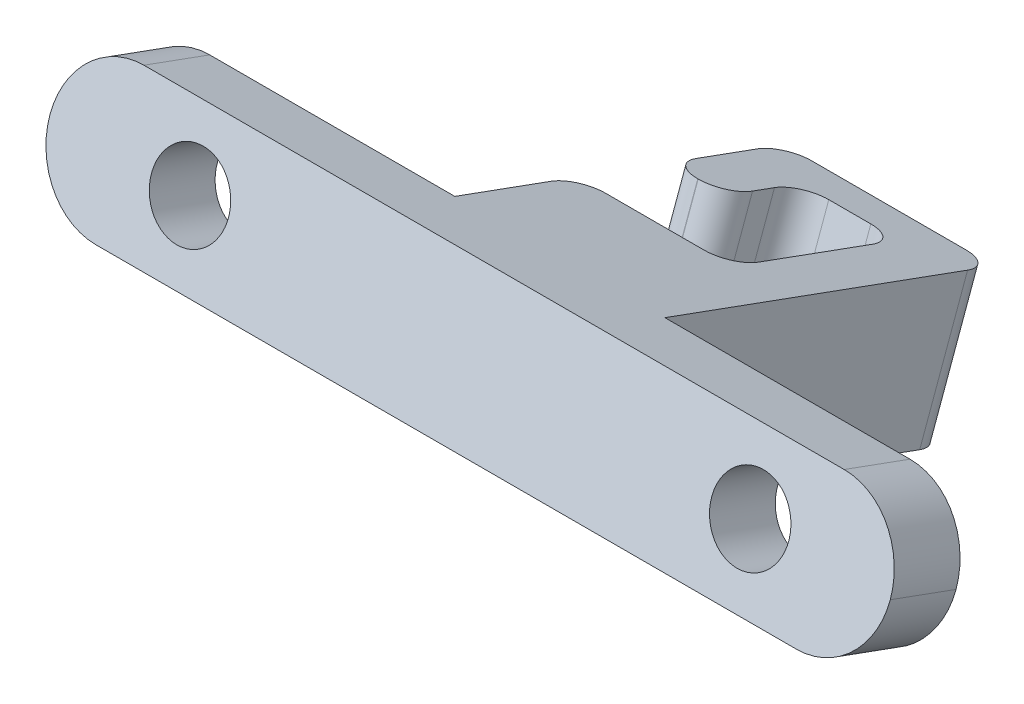
ISO-10303-21;
HEADER;
FILE_DESCRIPTION(('STEP AP214'),'2;1');
FILE_NAME('part.step','',(''),(''),'','','');
FILE_SCHEMA(('AUTOMOTIVE_DESIGN { 1 0 10303 214 1 1 1 1 }'));
ENDSEC;
DATA;
#1=APPLICATION_CONTEXT('core data for automotive mechanical design processes');
#2=APPLICATION_PROTOCOL_DEFINITION('international standard','automotive_design',2000,#1);
#3=PRODUCT_CONTEXT('',#1,'mechanical');
#4=PRODUCT('Part','Part','',(#3));
#5=PRODUCT_RELATED_PRODUCT_CATEGORY('part','',(#4));
#6=PRODUCT_DEFINITION_FORMATION('','',#4);
#7=PRODUCT_DEFINITION_CONTEXT('part definition',#1,'design');
#8=PRODUCT_DEFINITION('design','',#6,#7);
#9=PRODUCT_DEFINITION_SHAPE('','',#8);
#10=(LENGTH_UNIT() NAMED_UNIT(*) SI_UNIT(.MILLI.,.METRE.));
#11=(NAMED_UNIT(*) PLANE_ANGLE_UNIT() SI_UNIT($,.RADIAN.));
#12=(NAMED_UNIT(*) SI_UNIT($,.STERADIAN.) SOLID_ANGLE_UNIT());
#13=UNCERTAINTY_MEASURE_WITH_UNIT(LENGTH_MEASURE(1.E-05),#10,'distance_accuracy_value','');
#14=(GEOMETRIC_REPRESENTATION_CONTEXT(3) GLOBAL_UNCERTAINTY_ASSIGNED_CONTEXT((#13)) GLOBAL_UNIT_ASSIGNED_CONTEXT((#10,
#11,#12)) REPRESENTATION_CONTEXT('',''));
#15=CARTESIAN_POINT('',(0.,0.,0.));
#16=DIRECTION('',(0.,0.,1.));
#17=DIRECTION('',(1.,0.,0.));
#18=AXIS2_PLACEMENT_3D('',#15,#16,#17);
#19=CARTESIAN_POINT('',(2.5,85.1744674403331,-31.0009708677575));
#20=DIRECTION('',(0.,0.939692620785907,-0.342020143325673));
#21=DIRECTION('',(0.,0.342020143325673,0.939692620785907));
#22=AXIS2_PLACEMENT_3D('',#19,#20,#21);
#23=PLANE('',#22);
#24=DIRECTION('',(-1.,0.,0.));
#25=VECTOR('',#24,1.);
#26=CARTESIAN_POINT('',(2.5,95.8646289623417,-1.62999347571675));
#27=LINE('',#26,#25);
#28=CARTESIAN_POINT('',(1.5299929499164,95.8646289623417,-1.62999347571675));
#29=VERTEX_POINT('',#28);
#30=CARTESIAN_POINT('',(-5.5,95.8646289623417,-1.62999347571675));
#31=VERTEX_POINT('',#30);
#32=EDGE_CURVE('E372',#29,#31,#27,.T.);
#33=ORIENTED_EDGE('',*,*,#32,.T.);
#34=CARTESIAN_POINT('',(-5.5,96.5486692489931,0.249391765855053));
#35=DIRECTION('',(0.,0.939692620785907,-0.342020143325673));
#36=DIRECTION('',(0.,0.342020143325673,0.939692620785907));
#37=AXIS2_PLACEMENT_3D('',#34,#35,#36);
#38=CIRCLE('',#37,2.);
#39=CARTESIAN_POINT('',(-7.5,96.5486692489931,0.249391765855034));
#40=VERTEX_POINT('',#39);
#41=EDGE_CURVE('E203',#31,#40,#38,.T.);
#42=ORIENTED_EDGE('',*,*,#41,.T.);
#43=DIRECTION('',(0.,0.342020143325672,0.939692620785907));
#44=VECTOR('',#43,1.);
#45=CARTESIAN_POINT('',(-7.5,90.506376157383,-16.35167206507));
#46=LINE('',#45,#44);
#47=CARTESIAN_POINT('',(-7.5,99.0568797405248,7.14064345457764));
#48=VERTEX_POINT('',#47);
#49=EDGE_CURVE('E198',#40,#48,#46,.T.);
#50=ORIENTED_EDGE('',*,*,#49,.T.);
#51=DIRECTION('',(-1.,0.,0.));
#52=VECTOR('',#51,1.);
#53=CARTESIAN_POINT('',(30.,99.0568797405248,7.14064345457762));
#54=LINE('',#53,#52);
#55=CARTESIAN_POINT('',(-24.9999999999999,99.0568797405248,7.14064345457762));
#56=VERTEX_POINT('',#55);
#57=EDGE_CURVE('E201',#48,#56,#54,.T.);
#58=ORIENTED_EDGE('',*,*,#57,.T.);
#59=DIRECTION('',(0.,0.342020143325673,0.939692620785907));
#60=VECTOR('',#59,1.);
#61=CARTESIAN_POINT('',(-25.,85.1744674403331,-31.0009708677575));
#62=LINE('',#61,#60);
#63=CARTESIAN_POINT('',(-25.,100.766980457153,11.8391065585071));
#64=VERTEX_POINT('',#63);
#65=EDGE_CURVE('E284',#56,#64,#62,.T.);
#66=ORIENTED_EDGE('',*,*,#65,.T.);
#67=DIRECTION('',(-1.,0.,0.));
#68=VECTOR('',#67,1.);
#69=CARTESIAN_POINT('',(-2.5,100.766980457153,11.8391065585071));
#70=LINE('',#69,#68);
#71=CARTESIAN_POINT('',(25.,100.766980457153,11.8391065585071));
#72=VERTEX_POINT('',#71);
#73=EDGE_CURVE('E261',#72,#64,#70,.T.);
#74=ORIENTED_EDGE('',*,*,#73,.F.);
#75=DIRECTION('',(0.,0.342020143325673,0.939692620785907));
#76=VECTOR('',#75,1.);
#77=CARTESIAN_POINT('',(25.,85.1744674403331,-31.0009708677575));
#78=LINE('',#77,#76);
#79=CARTESIAN_POINT('',(25.,99.0568797405248,7.14064345457762));
#80=VERTEX_POINT('',#79);
#81=EDGE_CURVE('E281',#72,#80,#78,.F.);
#82=ORIENTED_EDGE('',*,*,#81,.T.);
#83=CARTESIAN_POINT('',(7.5,99.0568797405248,7.14064345457762));
#84=VERTEX_POINT('',#83);
#85=EDGE_CURVE('E218',#80,#84,#54,.T.);
#86=ORIENTED_EDGE('',*,*,#85,.T.);
#87=DIRECTION('',(0.,0.342020143325672,0.939692620785907));
#88=VECTOR('',#87,1.);
#89=CARTESIAN_POINT('',(7.5,90.506376157383,-16.35167206507));
#90=LINE('',#89,#88);
#91=CARTESIAN_POINT('',(7.5,91.1904164440344,-14.4722868234982));
#92=VERTEX_POINT('',#91);
#93=EDGE_CURVE('E208',#92,#84,#90,.T.);
#94=ORIENTED_EDGE('',*,*,#93,.F.);
#95=CARTESIAN_POINT('',(5.5,91.1904164440343,-14.4722868234982));
#96=DIRECTION('',(0.,0.939692620785907,-0.342020143325673));
#97=DIRECTION('',(0.,0.342020143325673,0.939692620785907));
#98=AXIS2_PLACEMENT_3D('',#95,#96,#97);
#99=CIRCLE('',#98,2.);
#100=CARTESIAN_POINT('',(5.5,90.506376157383,-16.35167206507));
#101=VERTEX_POINT('',#100);
#102=EDGE_CURVE('E306',#92,#101,#99,.T.);
#103=ORIENTED_EDGE('',*,*,#102,.T.);
#104=DIRECTION('',(1.,0.,0.));
#105=VECTOR('',#104,1.);
#106=CARTESIAN_POINT('',(7.5,90.506376157383,-16.35167206507));
#107=LINE('',#106,#105);
#108=CARTESIAN_POINT('',(-5.5,90.506376157383,-16.35167206507));
#109=VERTEX_POINT('',#108);
#110=EDGE_CURVE('E228',#109,#101,#107,.T.);
#111=ORIENTED_EDGE('',*,*,#110,.F.);
#112=CARTESIAN_POINT('',(-5.5,91.1904164440343,-14.4722868234982));
#113=DIRECTION('',(0.,0.939692620785907,-0.342020143325673));
#114=DIRECTION('',(0.,0.342020143325673,0.939692620785907));
#115=AXIS2_PLACEMENT_3D('',#112,#113,#114);
#116=CIRCLE('',#115,2.);
#117=CARTESIAN_POINT('',(-7.5,91.1904164440344,-14.4722868234982));
#118=VERTEX_POINT('',#117);
#119=EDGE_CURVE('E308',#109,#118,#116,.T.);
#120=ORIENTED_EDGE('',*,*,#119,.T.);
#121=CARTESIAN_POINT('',(-7.5,92.7864476724107,-10.0872270627899));
#122=VERTEX_POINT('',#121);
#123=EDGE_CURVE('E207',#118,#122,#46,.T.);
#124=ORIENTED_EDGE('',*,*,#123,.T.);
#125=CARTESIAN_POINT('',(-5.5,92.7864476724106,-10.0872270627899));
#126=DIRECTION('',(0.,0.939692620785907,-0.342020143325673));
#127=DIRECTION('',(0.,0.342020143325673,0.939692620785907));
#128=AXIS2_PLACEMENT_3D('',#125,#126,#127);
#129=CIRCLE('',#128,2.);
#130=CARTESIAN_POINT('',(-5.5,93.470487959062,-8.20784182121811));
#131=VERTEX_POINT('',#130);
#132=EDGE_CURVE('E312',#122,#131,#129,.T.);
#133=ORIENTED_EDGE('',*,*,#132,.T.);
#134=DIRECTION('',(1.,0.,0.));
#135=VECTOR('',#134,1.);
#136=CARTESIAN_POINT('',(2.5,93.470487959062,-8.20784182121811));
#137=LINE('',#136,#135);
#138=CARTESIAN_POINT('',(-5.4700070500836,93.470487959062,-8.20784182121811));
#139=VERTEX_POINT('',#138);
#140=EDGE_CURVE('E719',#131,#139,#137,.T.);
#141=ORIENTED_EDGE('',*,*,#140,.T.);
#142=CARTESIAN_POINT('',(-5.4700070500836,92.7864476724106,-10.0872270627899));
#143=DIRECTION('',(0.,0.939692620785907,-0.342020143325673));
#144=DIRECTION('',(0.,0.342020143325673,0.939692620785907));
#145=AXIS2_PLACEMENT_3D('',#142,#143,#144);
#146=CIRCLE('',#145,2.);
#147=CARTESIAN_POINT('',(-3.4700070500836,92.7864476724107,-10.0872270627899));
#148=VERTEX_POINT('',#147);
#149=EDGE_CURVE('E310',#139,#148,#146,.T.);
#150=ORIENTED_EDGE('',*,*,#149,.T.);
#151=DIRECTION('',(0.,0.342020143325673,0.939692620785907));
#152=VECTOR('',#151,1.);
#153=CARTESIAN_POINT('',(-3.47000705008359,85.1744674403331,-31.0009708677575));
#154=LINE('',#153,#152);
#155=CARTESIAN_POINT('',(-3.4700070500836,92.2164768740113,-11.6532089611405));
#156=VERTEX_POINT('',#155);
#157=EDGE_CURVE('E385',#156,#148,#154,.T.);
#158=ORIENTED_EDGE('',*,*,#157,.F.);
#159=CARTESIAN_POINT('',(-1.4700070500836,92.2164768740113,-11.6532089611405));
#160=DIRECTION('',(0.,0.939692620785907,-0.342020143325673));
#161=DIRECTION('',(0.,0.342020143325673,0.939692620785907));
#162=AXIS2_PLACEMENT_3D('',#159,#160,#161);
#163=CIRCLE('',#162,2.);
#164=CARTESIAN_POINT('',(-1.4700070500836,91.53243658736,-13.5325942027123));
#165=VERTEX_POINT('',#164);
#166=EDGE_CURVE('E357',#156,#165,#163,.F.);
#167=ORIENTED_EDGE('',*,*,#166,.T.);
#168=DIRECTION('',(-1.,0.,0.));
#169=VECTOR('',#168,1.);
#170=CARTESIAN_POINT('',(2.5,91.53243658736,-13.5325942027123));
#171=LINE('',#170,#169);
#172=CARTESIAN_POINT('',(1.5299929499164,91.53243658736,-13.5325942027123));
#173=VERTEX_POINT('',#172);
#174=EDGE_CURVE('E380',#173,#165,#171,.T.);
#175=ORIENTED_EDGE('',*,*,#174,.F.);
#176=CARTESIAN_POINT('',(1.5299929499164,92.2164768740113,-11.6532089611405));
#177=DIRECTION('',(0.,0.939692620785907,-0.342020143325673));
#178=DIRECTION('',(0.,0.342020143325673,0.939692620785907));
#179=AXIS2_PLACEMENT_3D('',#176,#177,#178);
#180=CIRCLE('',#179,2.);
#181=CARTESIAN_POINT('',(3.5299929499164,92.2164768740113,-11.6532089611405));
#182=VERTEX_POINT('',#181);
#183=EDGE_CURVE('E11',#173,#182,#180,.F.);
#184=ORIENTED_EDGE('',*,*,#183,.T.);
#185=DIRECTION('',(0.,0.342020143325673,0.939692620785907));
#186=VECTOR('',#185,1.);
#187=CARTESIAN_POINT('',(3.52999294991641,85.1744674403331,-31.0009708677575));
#188=LINE('',#187,#186);
#189=CARTESIAN_POINT('',(3.5299929499164,95.1805886756904,-3.50937871728857));
#190=VERTEX_POINT('',#189);
#191=EDGE_CURVE('E231',#182,#190,#188,.T.);
#192=ORIENTED_EDGE('',*,*,#191,.T.);
#193=CARTESIAN_POINT('',(1.5299929499164,95.1805886756904,-3.50937871728857));
#194=DIRECTION('',(0.,0.939692620785907,-0.342020143325673));
#195=DIRECTION('',(0.,0.342020143325673,0.939692620785907));
#196=AXIS2_PLACEMENT_3D('',#193,#194,#195);
#197=CIRCLE('',#196,2.);
#198=EDGE_CURVE('E354',#190,#29,#197,.F.);
#199=ORIENTED_EDGE('',*,*,#198,.T.);
#200=EDGE_LOOP('',(#33,#42,#50,#58,#66,#74,#82,#86,#94,#103,#111,#120,#124,#133,#141,#150,#158,
#167,#175,#184,#192,#199));
#201=FACE_BOUND('',#200,.T.);
#202=ADVANCED_FACE('F37',(#201),#23,.T.);
#203=CARTESIAN_POINT('',(-2.5,91.3700542492941,15.2593079917638));
#204=DIRECTION('',(0.,0.939692620785907,-0.342020143325672));
#205=DIRECTION('',(0.,0.342020143325672,0.939692620785907));
#206=AXIS2_PLACEMENT_3D('',#203,#204,#205);
#207=PLANE('',#206);
#208=DIRECTION('',(0.,0.342020143325672,0.939692620785907));
#209=VECTOR('',#208,1.);
#210=CARTESIAN_POINT('',(-7.5,81.109449949524,-12.9314706318133));
#211=LINE('',#210,#209);
#212=CARTESIAN_POINT('',(-7.5,87.151743041134,3.66959319911176));
#213=VERTEX_POINT('',#212);
#214=CARTESIAN_POINT('',(-7.5,89.6599535326658,10.5608448878343));
#215=VERTEX_POINT('',#214);
#216=EDGE_CURVE('E223',#213,#215,#211,.T.);
#217=ORIENTED_EDGE('',*,*,#216,.F.);
#218=CARTESIAN_POINT('',(-5.5,87.151743041134,3.66959319911176));
#219=DIRECTION('',(0.,0.939692620785907,-0.342020143325672));
#220=DIRECTION('',(0.,0.342020143325672,0.939692620785907));
#221=AXIS2_PLACEMENT_3D('',#218,#219,#220);
#222=CIRCLE('',#221,2.);
#223=CARTESIAN_POINT('',(-5.5,86.4677027544827,1.79020795753994));
#224=VERTEX_POINT('',#223);
#225=EDGE_CURVE('E324',#213,#224,#222,.F.);
#226=ORIENTED_EDGE('',*,*,#225,.T.);
#227=DIRECTION('',(1.,0.,0.));
#228=VECTOR('',#227,1.);
#229=CARTESIAN_POINT('',(0.,86.4677027544827,1.79020795753994));
#230=LINE('',#229,#228);
#231=CARTESIAN_POINT('',(1.5299929499164,86.4677027544827,1.79020795753994));
#232=VERTEX_POINT('',#231);
#233=EDGE_CURVE('E729',#224,#232,#230,.T.);
#234=ORIENTED_EDGE('',*,*,#233,.T.);
#235=CARTESIAN_POINT('',(1.5299929499164,85.7836624678313,-0.0891772840318581));
#236=DIRECTION('',(0.,0.939692620785907,-0.342020143325672));
#237=DIRECTION('',(0.,0.342020143325672,0.939692620785907));
#238=AXIS2_PLACEMENT_3D('',#235,#236,#237);
#239=CIRCLE('',#238,2.);
#240=CARTESIAN_POINT('',(3.5299929499164,85.7836624678314,-0.0891772840318598));
#241=VERTEX_POINT('',#240);
#242=EDGE_CURVE('E352',#232,#241,#239,.T.);
#243=ORIENTED_EDGE('',*,*,#242,.T.);
#244=DIRECTION('',(0.,-0.342020143325672,-0.939692620785907));
#245=VECTOR('',#244,1.);
#246=CARTESIAN_POINT('',(3.52999294991641,75.7775412324742,-27.5807694345008));
#247=LINE('',#246,#245);
#248=CARTESIAN_POINT('',(3.5299929499164,82.8195506661524,-8.23300752788379));
#249=VERTEX_POINT('',#248);
#250=EDGE_CURVE('E363',#241,#249,#247,.T.);
#251=ORIENTED_EDGE('',*,*,#250,.T.);
#252=CARTESIAN_POINT('',(1.5299929499164,82.8195506661523,-8.23300752788378));
#253=DIRECTION('',(0.,0.939692620785907,-0.342020143325672));
#254=DIRECTION('',(0.,0.342020143325672,0.939692620785907));
#255=AXIS2_PLACEMENT_3D('',#252,#253,#254);
#256=CIRCLE('',#255,2.);
#257=CARTESIAN_POINT('',(1.5299929499164,82.135510379501,-10.1123927694556));
#258=VERTEX_POINT('',#257);
#259=EDGE_CURVE('E45',#249,#258,#256,.T.);
#260=ORIENTED_EDGE('',*,*,#259,.T.);
#261=DIRECTION('',(1.,0.,0.));
#262=VECTOR('',#261,1.);
#263=CARTESIAN_POINT('',(0.,82.135510379501,-10.1123927694556));
#264=LINE('',#263,#262);
#265=CARTESIAN_POINT('',(-1.4700070500836,82.135510379501,-10.1123927694556));
#266=VERTEX_POINT('',#265);
#267=EDGE_CURVE('E361',#266,#258,#264,.T.);
#268=ORIENTED_EDGE('',*,*,#267,.F.);
#269=CARTESIAN_POINT('',(-1.4700070500836,82.8195506661523,-8.23300752788378));
#270=DIRECTION('',(0.,0.939692620785907,-0.342020143325672));
#271=DIRECTION('',(0.,0.342020143325672,0.939692620785907));
#272=AXIS2_PLACEMENT_3D('',#269,#270,#271);
#273=CIRCLE('',#272,2.);
#274=CARTESIAN_POINT('',(-3.4700070500836,82.8195506661524,-8.23300752788378));
#275=VERTEX_POINT('',#274);
#276=EDGE_CURVE('E52',#266,#275,#273,.T.);
#277=ORIENTED_EDGE('',*,*,#276,.T.);
#278=DIRECTION('',(0.,-0.342020143325672,-0.939692620785907));
#279=VECTOR('',#278,1.);
#280=CARTESIAN_POINT('',(-3.47000705008359,75.7775412324742,-27.5807694345008));
#281=LINE('',#280,#279);
#282=CARTESIAN_POINT('',(-3.4700070500836,83.3895214645516,-6.66702562953321));
#283=VERTEX_POINT('',#282);
#284=EDGE_CURVE('E373',#283,#275,#281,.T.);
#285=ORIENTED_EDGE('',*,*,#284,.F.);
#286=CARTESIAN_POINT('',(-5.4700070500836,83.3895214645516,-6.6670256295332));
#287=DIRECTION('',(0.,0.939692620785907,-0.342020143325672));
#288=DIRECTION('',(0.,0.342020143325672,0.939692620785907));
#289=AXIS2_PLACEMENT_3D('',#286,#287,#288);
#290=CIRCLE('',#289,2.);
#291=CARTESIAN_POINT('',(-5.4700070500836,84.073561751203,-4.7876403879614));
#292=VERTEX_POINT('',#291);
#293=EDGE_CURVE('E60',#283,#292,#290,.F.);
#294=ORIENTED_EDGE('',*,*,#293,.T.);
#295=DIRECTION('',(-1.,0.,0.));
#296=VECTOR('',#295,1.);
#297=CARTESIAN_POINT('',(0.,84.073561751203,-4.7876403879614));
#298=LINE('',#297,#296);
#299=CARTESIAN_POINT('',(-5.5,84.073561751203,-4.7876403879614));
#300=VERTEX_POINT('',#299);
#301=EDGE_CURVE('E727',#292,#300,#298,.T.);
#302=ORIENTED_EDGE('',*,*,#301,.T.);
#303=CARTESIAN_POINT('',(-5.5,83.3895214645516,-6.66702562953321));
#304=DIRECTION('',(0.,0.939692620785907,-0.342020143325672));
#305=DIRECTION('',(0.,0.342020143325672,0.939692620785907));
#306=AXIS2_PLACEMENT_3D('',#303,#304,#305);
#307=CIRCLE('',#306,2.);
#308=CARTESIAN_POINT('',(-7.5,83.3895214645516,-6.66702562953322));
#309=VERTEX_POINT('',#308);
#310=EDGE_CURVE('E322',#300,#309,#307,.F.);
#311=ORIENTED_EDGE('',*,*,#310,.T.);
#312=CARTESIAN_POINT('',(-7.5,81.7934902361753,-11.0520853902415));
#313=VERTEX_POINT('',#312);
#314=EDGE_CURVE('E236',#313,#309,#211,.T.);
#315=ORIENTED_EDGE('',*,*,#314,.F.);
#316=CARTESIAN_POINT('',(-5.5,81.7934902361753,-11.0520853902415));
#317=DIRECTION('',(0.,0.939692620785907,-0.342020143325672));
#318=DIRECTION('',(0.,0.342020143325672,0.939692620785907));
#319=AXIS2_PLACEMENT_3D('',#316,#317,#318);
#320=CIRCLE('',#319,2.);
#321=CARTESIAN_POINT('',(-5.5,81.109449949524,-12.9314706318133));
#322=VERTEX_POINT('',#321);
#323=EDGE_CURVE('E319',#313,#322,#320,.F.);
#324=ORIENTED_EDGE('',*,*,#323,.T.);
#325=DIRECTION('',(-1.,0.,0.));
#326=VECTOR('',#325,1.);
#327=CARTESIAN_POINT('',(7.5,81.109449949524,-12.9314706318133));
#328=LINE('',#327,#326);
#329=CARTESIAN_POINT('',(5.5,81.109449949524,-12.9314706318133));
#330=VERTEX_POINT('',#329);
#331=EDGE_CURVE('E224',#330,#322,#328,.T.);
#332=ORIENTED_EDGE('',*,*,#331,.F.);
#333=CARTESIAN_POINT('',(5.5,81.7934902361753,-11.0520853902415));
#334=DIRECTION('',(0.,0.939692620785907,-0.342020143325672));
#335=DIRECTION('',(0.,0.342020143325672,0.939692620785907));
#336=AXIS2_PLACEMENT_3D('',#333,#334,#335);
#337=CIRCLE('',#336,2.);
#338=CARTESIAN_POINT('',(7.5,81.7934902361753,-11.0520853902415));
#339=VERTEX_POINT('',#338);
#340=EDGE_CURVE('E317',#330,#339,#337,.F.);
#341=ORIENTED_EDGE('',*,*,#340,.T.);
#342=DIRECTION('',(0.,0.342020143325672,0.939692620785907));
#343=VECTOR('',#342,1.);
#344=CARTESIAN_POINT('',(7.5,81.109449949524,-12.9314706318133));
#345=LINE('',#344,#343);
#346=CARTESIAN_POINT('',(7.5,89.6599535326658,10.5608448878343));
#347=VERTEX_POINT('',#346);
#348=EDGE_CURVE('E239',#339,#347,#345,.T.);
#349=ORIENTED_EDGE('',*,*,#348,.T.);
#350=DIRECTION('',(1.,0.,0.));
#351=VECTOR('',#350,1.);
#352=CARTESIAN_POINT('',(30.,89.6599535326658,10.5608448878343));
#353=LINE('',#352,#351);
#354=CARTESIAN_POINT('',(25.,89.6599535326658,10.5608448878343));
#355=VERTEX_POINT('',#354);
#356=EDGE_CURVE('E255',#347,#355,#353,.T.);
#357=ORIENTED_EDGE('',*,*,#356,.T.);
#358=DIRECTION('',(0.,0.342020143325672,0.939692620785907));
#359=VECTOR('',#358,1.);
#360=CARTESIAN_POINT('',(25.,91.3700542492941,15.2593079917639));
#361=LINE('',#360,#359);
#362=CARTESIAN_POINT('',(25.,91.3700542492941,15.2593079917638));
#363=VERTEX_POINT('',#362);
#364=EDGE_CURVE('E272',#355,#363,#361,.T.);
#365=ORIENTED_EDGE('',*,*,#364,.T.);
#366=DIRECTION('',(1.,0.,0.));
#367=VECTOR('',#366,1.);
#368=CARTESIAN_POINT('',(-2.5,91.3700542492941,15.2593079917638));
#369=LINE('',#368,#367);
#370=CARTESIAN_POINT('',(-25.,91.3700542492941,15.2593079917638));
#371=VERTEX_POINT('',#370);
#372=EDGE_CURVE('E258',#371,#363,#369,.T.);
#373=ORIENTED_EDGE('',*,*,#372,.F.);
#374=DIRECTION('',(0.,0.342020143325672,0.939692620785907));
#375=VECTOR('',#374,1.);
#376=CARTESIAN_POINT('',(-25.,89.6599535326658,10.5608448878343));
#377=LINE('',#376,#375);
#378=CARTESIAN_POINT('',(-24.9999999999999,89.6599535326658,10.5608448878343));
#379=VERTEX_POINT('',#378);
#380=EDGE_CURVE('E275',#371,#379,#377,.F.);
#381=ORIENTED_EDGE('',*,*,#380,.T.);
#382=EDGE_CURVE('E219',#379,#215,#353,.T.);
#383=ORIENTED_EDGE('',*,*,#382,.T.);
#384=EDGE_LOOP('',(#217,#226,#234,#243,#251,#260,#268,#277,#285,#294,#302,#311,#315,#324,#332,
#341,#349,#357,#365,#373,#381,#383));
#385=FACE_BOUND('',#384,.T.);
#386=ADVANCED_FACE('F360',(#385),#207,.F.);
#387=CARTESIAN_POINT('',(-7.5,90.506376157383,-16.35167206507));
#388=DIRECTION('',(1.,0.,0.));
#389=DIRECTION('',(0.,0.,-1.));
#390=AXIS2_PLACEMENT_3D('',#387,#388,#389);
#391=PLANE('',#390);
#392=ORIENTED_EDGE('',*,*,#314,.T.);
#393=DIRECTION('',(0.,-0.939692620785907,0.342020143325672));
#394=VECTOR('',#393,1.);
#395=CARTESIAN_POINT('',(-7.5,92.7864476724107,-10.0872270627899));
#396=LINE('',#395,#394);
#397=EDGE_CURVE('E333',#309,#122,#396,.F.);
#398=ORIENTED_EDGE('',*,*,#397,.T.);
#399=ORIENTED_EDGE('',*,*,#123,.F.);
#400=DIRECTION('',(0.,0.939692620785907,-0.342020143325672));
#401=VECTOR('',#400,1.);
#402=CARTESIAN_POINT('',(-7.5,81.7934902361754,-11.0520853902415));
#403=LINE('',#402,#401);
#404=EDGE_CURVE('E331',#118,#313,#403,.F.);
#405=ORIENTED_EDGE('',*,*,#404,.T.);
#406=EDGE_LOOP('',(#392,#398,#399,#405));
#407=FACE_BOUND('',#406,.T.);
#408=ADVANCED_FACE('F448',(#407),#391,.F.);
#409=ORIENTED_EDGE('',*,*,#49,.F.);
#410=DIRECTION('',(0.,0.939692620785907,-0.342020143325672));
#411=VECTOR('',#410,1.);
#412=CARTESIAN_POINT('',(-7.5,87.151743041134,3.66959319911176));
#413=LINE('',#412,#411);
#414=EDGE_CURVE('E315',#40,#213,#413,.F.);
#415=ORIENTED_EDGE('',*,*,#414,.T.);
#416=ORIENTED_EDGE('',*,*,#216,.T.);
#417=DIRECTION('',(0.,0.939692620785907,-0.342020143325672));
#418=VECTOR('',#417,1.);
#419=CARTESIAN_POINT('',(-7.5,99.0568797405248,7.14064345457764));
#420=LINE('',#419,#418);
#421=EDGE_CURVE('E213',#215,#48,#420,.T.);
#422=ORIENTED_EDGE('',*,*,#421,.T.);
#423=EDGE_LOOP('',(#409,#415,#416,#422));
#424=FACE_BOUND('',#423,.T.);
#425=ADVANCED_FACE('F221',(#424),#391,.F.);
#426=CARTESIAN_POINT('',(0.,13.8824123001916,38.1416143223351));
#427=DIRECTION('',(0.,0.342020143325672,0.939692620785907));
#428=DIRECTION('',(0.,-0.939692620785907,0.342020143325672));
#429=AXIS2_PLACEMENT_3D('',#426,#427,#428);
#430=PLANE('',#429);
#431=CARTESIAN_POINT('',(20.,94.3584166365954,8.85074417120596));
#432=DIRECTION('',(0.,0.342020143325672,0.939692620785907));
#433=DIRECTION('',(0.,-0.939692620785907,0.342020143325672));
#434=AXIS2_PLACEMENT_3D('',#431,#432,#433);
#435=CIRCLE('',#434,2.74999999999999);
#436=CARTESIAN_POINT('',(20.,91.7742619294341,9.79129956535155));
#437=VERTEX_POINT('',#436);
#438=EDGE_CURVE('E252',#437,#437,#435,.T.);
#439=ORIENTED_EDGE('',*,*,#438,.T.);
#440=EDGE_LOOP('',(#439));
#441=FACE_BOUND('',#440,.T.);
#442=DIRECTION('',(0.,-0.939692620785907,0.342020143325672));
#443=VECTOR('',#442,1.);
#444=CARTESIAN_POINT('',(7.5,99.0568797405248,7.14064345457764));
#445=LINE('',#444,#443);
#446=EDGE_CURVE('E225',#84,#347,#445,.T.);
#447=ORIENTED_EDGE('',*,*,#446,.F.);
#448=ORIENTED_EDGE('',*,*,#85,.F.);
#449=CARTESIAN_POINT('',(25.,94.3584166365953,8.85074417120598));
#450=DIRECTION('',(0.,0.342020143325672,0.939692620785907));
#451=DIRECTION('',(0.,-0.939692620785907,0.342020143325672));
#452=AXIS2_PLACEMENT_3D('',#449,#450,#451);
#453=CIRCLE('',#452,5.);
#454=CARTESIAN_POINT('',(30.,94.3584166365953,8.85074417120599));
#455=VERTEX_POINT('',#454);
#456=EDGE_CURVE('E286',#80,#455,#453,.F.);
#457=ORIENTED_EDGE('',*,*,#456,.T.);
#458=CARTESIAN_POINT('',(25.,94.3584166365953,8.85074417120597));
#459=DIRECTION('',(0.,0.342020143325672,0.939692620785907));
#460=DIRECTION('',(0.,-0.939692620785907,0.342020143325672));
#461=AXIS2_PLACEMENT_3D('',#458,#459,#460);
#462=CIRCLE('',#461,5.);
#463=EDGE_CURVE('E288',#455,#355,#462,.F.);
#464=ORIENTED_EDGE('',*,*,#463,.T.);
#465=ORIENTED_EDGE('',*,*,#356,.F.);
#466=EDGE_LOOP('',(#447,#448,#457,#464,#465));
#467=FACE_BOUND('',#466,.T.);
#468=ADVANCED_FACE('F405',(#441,#467),#430,.F.);
#469=CARTESIAN_POINT('',(-20.,94.3584166365954,8.85074417120596));
#470=DIRECTION('',(0.,0.342020143325672,0.939692620785907));
#471=DIRECTION('',(0.,-0.939692620785907,0.342020143325672));
#472=AXIS2_PLACEMENT_3D('',#469,#470,#471);
#473=CIRCLE('',#472,2.74999999999999);
#474=CARTESIAN_POINT('',(-20.,91.7742619294341,9.79129956535155));
#475=VERTEX_POINT('',#474);
#476=EDGE_CURVE('E245',#475,#475,#473,.T.);
#477=ORIENTED_EDGE('',*,*,#476,.T.);
#478=EDGE_LOOP('',(#477));
#479=FACE_BOUND('',#478,.T.);
#480=ORIENTED_EDGE('',*,*,#421,.F.);
#481=ORIENTED_EDGE('',*,*,#382,.F.);
#482=CARTESIAN_POINT('',(-25.,94.3584166365953,8.85074417120598));
#483=DIRECTION('',(0.,0.342020143325672,0.939692620785907));
#484=DIRECTION('',(0.,-0.939692620785907,0.342020143325672));
#485=AXIS2_PLACEMENT_3D('',#482,#483,#484);
#486=CIRCLE('',#485,5.);
#487=CARTESIAN_POINT('',(-30.,94.3584166365953,8.85074417120599));
#488=VERTEX_POINT('',#487);
#489=EDGE_CURVE('E279',#379,#488,#486,.F.);
#490=ORIENTED_EDGE('',*,*,#489,.T.);
#491=CARTESIAN_POINT('',(-25.,94.3584166365953,8.85074417120599));
#492=DIRECTION('',(0.,0.342020143325672,0.939692620785907));
#493=DIRECTION('',(0.,-0.939692620785907,0.342020143325672));
#494=AXIS2_PLACEMENT_3D('',#491,#492,#493);
#495=CIRCLE('',#494,5.);
#496=EDGE_CURVE('E216',#488,#56,#495,.F.);
#497=ORIENTED_EDGE('',*,*,#496,.T.);
#498=ORIENTED_EDGE('',*,*,#57,.F.);
#499=EDGE_LOOP('',(#480,#481,#490,#497,#498));
#500=FACE_BOUND('',#499,.T.);
#501=ADVANCED_FACE('F212',(#479,#500),#430,.F.);
#502=CARTESIAN_POINT('',(0.,15.59251301682,42.8400774262646));
#503=DIRECTION('',(0.,0.342020143325673,0.939692620785907));
#504=DIRECTION('',(0.,-0.939692620785907,0.342020143325673));
#505=AXIS2_PLACEMENT_3D('',#502,#503,#504);
#506=PLANE('',#505);
#507=CARTESIAN_POINT('',(-20.,96.0685173532237,13.5492072751355));
#508=DIRECTION('',(0.,0.342020143325672,0.939692620785907));
#509=DIRECTION('',(0.,-0.939692620785907,0.342020143325672));
#510=AXIS2_PLACEMENT_3D('',#507,#508,#509);
#511=CIRCLE('',#510,2.74999999999999);
#512=CARTESIAN_POINT('',(-20.,93.4843626460625,14.4897626692811));
#513=VERTEX_POINT('',#512);
#514=EDGE_CURVE('E242',#513,#513,#511,.T.);
#515=ORIENTED_EDGE('',*,*,#514,.F.);
#516=EDGE_LOOP('',(#515));
#517=FACE_BOUND('',#516,.T.);
#518=CARTESIAN_POINT('',(20.,96.0685173532237,13.5492072751355));
#519=DIRECTION('',(0.,0.342020143325672,0.939692620785907));
#520=DIRECTION('',(0.,-0.939692620785907,0.342020143325672));
#521=AXIS2_PLACEMENT_3D('',#518,#519,#520);
#522=CIRCLE('',#521,2.74999999999999);
#523=CARTESIAN_POINT('',(20.,93.4843626460625,14.4897626692811));
#524=VERTEX_POINT('',#523);
#525=EDGE_CURVE('E249',#524,#524,#522,.T.);
#526=ORIENTED_EDGE('',*,*,#525,.F.);
#527=EDGE_LOOP('',(#526));
#528=FACE_BOUND('',#527,.T.);
#529=CARTESIAN_POINT('',(-25.,96.0685173532236,13.5492072751355));
#530=DIRECTION('',(0.,0.342020143325673,0.939692620785907));
#531=DIRECTION('',(0.,-0.939692620785907,0.342020143325673));
#532=AXIS2_PLACEMENT_3D('',#529,#530,#531);
#533=CIRCLE('',#532,5.);
#534=CARTESIAN_POINT('',(-30.,96.0685173532236,13.5492072751355));
#535=VERTEX_POINT('',#534);
#536=EDGE_CURVE('E268',#64,#535,#533,.T.);
#537=ORIENTED_EDGE('',*,*,#536,.T.);
#538=CARTESIAN_POINT('',(-25.,96.0685173532237,13.5492072751355));
#539=DIRECTION('',(0.,0.342020143325673,0.939692620785907));
#540=DIRECTION('',(0.,-0.939692620785907,0.342020143325673));
#541=AXIS2_PLACEMENT_3D('',#538,#539,#540);
#542=CIRCLE('',#541,5.);
#543=EDGE_CURVE('E270',#535,#371,#542,.T.);
#544=ORIENTED_EDGE('',*,*,#543,.T.);
#545=ORIENTED_EDGE('',*,*,#372,.T.);
#546=CARTESIAN_POINT('',(25.,96.0685173532237,13.5492072751355));
#547=DIRECTION('',(0.,0.342020143325673,0.939692620785907));
#548=DIRECTION('',(0.,-0.939692620785907,0.342020143325673));
#549=AXIS2_PLACEMENT_3D('',#546,#547,#548);
#550=CIRCLE('',#549,5.);
#551=CARTESIAN_POINT('',(30.,96.0685173532237,13.5492072751355));
#552=VERTEX_POINT('',#551);
#553=EDGE_CURVE('E266',#363,#552,#550,.T.);
#554=ORIENTED_EDGE('',*,*,#553,.T.);
#555=CARTESIAN_POINT('',(25.,96.0685173532236,13.5492072751355));
#556=DIRECTION('',(0.,0.342020143325673,0.939692620785907));
#557=DIRECTION('',(0.,-0.939692620785907,0.342020143325673));
#558=AXIS2_PLACEMENT_3D('',#555,#556,#557);
#559=CIRCLE('',#558,5.);
#560=EDGE_CURVE('E264',#552,#72,#559,.T.);
#561=ORIENTED_EDGE('',*,*,#560,.T.);
#562=ORIENTED_EDGE('',*,*,#73,.T.);
#563=EDGE_LOOP('',(#537,#544,#545,#554,#561,#562));
#564=FACE_BOUND('',#563,.T.);
#565=ADVANCED_FACE('F420',(#517,#528,#564),#506,.T.);
#566=CARTESIAN_POINT('',(20.,96.0685173532237,13.5492072751355));
#567=DIRECTION('',(0.,0.342020143325672,0.939692620785907));
#568=DIRECTION('',(0.,-0.939692620785907,0.342020143325672));
#569=AXIS2_PLACEMENT_3D('',#566,#567,#568);
#570=CYLINDRICAL_SURFACE('',#569,2.74999999999999);
#571=ORIENTED_EDGE('',*,*,#525,.T.);
#572=EDGE_LOOP('',(#571));
#573=FACE_BOUND('',#572,.T.);
#574=ORIENTED_EDGE('',*,*,#438,.F.);
#575=EDGE_LOOP('',(#574));
#576=FACE_BOUND('',#575,.T.);
#577=ADVANCED_FACE('F438',(#573,#576),#570,.F.);
#578=CARTESIAN_POINT('',(-20.,96.0685173532237,13.5492072751355));
#579=DIRECTION('',(0.,0.342020143325672,0.939692620785907));
#580=DIRECTION('',(0.,-0.939692620785907,0.342020143325672));
#581=AXIS2_PLACEMENT_3D('',#578,#579,#580);
#582=CYLINDRICAL_SURFACE('',#581,2.74999999999999);
#583=ORIENTED_EDGE('',*,*,#514,.T.);
#584=EDGE_LOOP('',(#583));
#585=FACE_BOUND('',#584,.T.);
#586=ORIENTED_EDGE('',*,*,#476,.F.);
#587=EDGE_LOOP('',(#586));
#588=FACE_BOUND('',#587,.T.);
#589=ADVANCED_FACE('F431',(#585,#588),#582,.F.);
#590=CARTESIAN_POINT('',(-25.,80.4760043364036,-29.2908701511292));
#591=DIRECTION('',(0.,0.342020143325673,0.939692620785907));
#592=DIRECTION('',(0.,-0.939692620785907,0.342020143325673));
#593=AXIS2_PLACEMENT_3D('',#590,#591,#592);
#594=CYLINDRICAL_SURFACE('',#593,5.);
#595=ORIENTED_EDGE('',*,*,#65,.F.);
#596=ORIENTED_EDGE('',*,*,#496,.F.);
#597=DIRECTION('',(0.,0.342020143325673,0.939692620785907));
#598=VECTOR('',#597,1.);
#599=CARTESIAN_POINT('',(-30.,94.3584166365953,8.85074417120598));
#600=LINE('',#599,#598);
#601=EDGE_CURVE('E246',#535,#488,#600,.F.);
#602=ORIENTED_EDGE('',*,*,#601,.F.);
#603=ORIENTED_EDGE('',*,*,#536,.F.);
#604=EDGE_LOOP('',(#595,#596,#602,#603));
#605=FACE_BOUND('',#604,.T.);
#606=ADVANCED_FACE('F429',(#605),#594,.T.);
#607=CARTESIAN_POINT('',(-25.,94.3584166365953,8.85074417120598));
#608=DIRECTION('',(0.,-0.342020143325672,-0.939692620785907));
#609=DIRECTION('',(0.,0.939692620785907,-0.342020143325672));
#610=AXIS2_PLACEMENT_3D('',#607,#608,#609);
#611=CYLINDRICAL_SURFACE('',#610,5.);
#612=ORIENTED_EDGE('',*,*,#489,.F.);
#613=ORIENTED_EDGE('',*,*,#380,.F.);
#614=ORIENTED_EDGE('',*,*,#543,.F.);
#615=ORIENTED_EDGE('',*,*,#601,.T.);
#616=EDGE_LOOP('',(#612,#613,#614,#615));
#617=FACE_BOUND('',#616,.T.);
#618=ADVANCED_FACE('F426',(#617),#611,.T.);
#619=CARTESIAN_POINT('',(25.,94.3584166365953,8.85074417120598));
#620=DIRECTION('',(0.,0.342020143325673,0.939692620785907));
#621=DIRECTION('',(0.,-0.939692620785907,0.342020143325673));
#622=AXIS2_PLACEMENT_3D('',#619,#620,#621);
#623=CYLINDRICAL_SURFACE('',#622,5.);
#624=DIRECTION('',(0.,0.342020143325673,0.939692620785907));
#625=VECTOR('',#624,1.);
#626=CARTESIAN_POINT('',(30.,94.3584166365953,8.85074417120598));
#627=LINE('',#626,#625);
#628=EDGE_CURVE('E241',#455,#552,#627,.T.);
#629=ORIENTED_EDGE('',*,*,#628,.F.);
#630=ORIENTED_EDGE('',*,*,#456,.F.);
#631=ORIENTED_EDGE('',*,*,#81,.F.);
#632=ORIENTED_EDGE('',*,*,#560,.F.);
#633=EDGE_LOOP('',(#629,#630,#631,#632));
#634=FACE_BOUND('',#633,.T.);
#635=ADVANCED_FACE('F412',(#634),#623,.T.);
#636=CARTESIAN_POINT('',(25.,96.0685173532237,13.5492072751355));
#637=DIRECTION('',(0.,-0.342020143325672,-0.939692620785907));
#638=DIRECTION('',(0.,0.939692620785907,-0.342020143325672));
#639=AXIS2_PLACEMENT_3D('',#636,#637,#638);
#640=CYLINDRICAL_SURFACE('',#639,5.);
#641=ORIENTED_EDGE('',*,*,#463,.F.);
#642=ORIENTED_EDGE('',*,*,#628,.T.);
#643=ORIENTED_EDGE('',*,*,#553,.F.);
#644=ORIENTED_EDGE('',*,*,#364,.F.);
#645=EDGE_LOOP('',(#641,#642,#643,#644));
#646=FACE_BOUND('',#645,.T.);
#647=ADVANCED_FACE('F416',(#646),#640,.T.);
#648=CARTESIAN_POINT('',(7.5,90.506376157383,-16.35167206507));
#649=DIRECTION('',(-1.,0.,0.));
#650=DIRECTION('',(0.,-1.,0.));
#651=AXIS2_PLACEMENT_3D('',#648,#649,#650);
#652=PLANE('',#651);
#653=ORIENTED_EDGE('',*,*,#348,.F.);
#654=DIRECTION('',(0.,-0.939692620785907,0.342020143325672));
#655=VECTOR('',#654,1.);
#656=CARTESIAN_POINT('',(7.5,91.1904164440344,-14.4722868234982));
#657=LINE('',#656,#655);
#658=EDGE_CURVE('E350',#339,#92,#657,.F.);
#659=ORIENTED_EDGE('',*,*,#658,.T.);
#660=ORIENTED_EDGE('',*,*,#93,.T.);
#661=ORIENTED_EDGE('',*,*,#446,.T.);
#662=EDGE_LOOP('',(#653,#659,#660,#661));
#663=FACE_BOUND('',#662,.T.);
#664=ADVANCED_FACE('F401',(#663),#652,.F.);
#665=CARTESIAN_POINT('',(0.,5.33190871704981,14.6492988026874));
#666=DIRECTION('',(0.,-0.342020143325672,-0.939692620785907));
#667=DIRECTION('',(0.,0.939692620785907,-0.342020143325672));
#668=AXIS2_PLACEMENT_3D('',#665,#666,#667);
#669=PLANE('',#668);
#670=ORIENTED_EDGE('',*,*,#331,.T.);
#671=DIRECTION('',(0.,0.939692620785907,-0.342020143325672));
#672=VECTOR('',#671,1.);
#673=CARTESIAN_POINT('',(-5.5,90.5063761573831,-16.35167206507));
#674=LINE('',#673,#672);
#675=EDGE_CURVE('E347',#322,#109,#674,.T.);
#676=ORIENTED_EDGE('',*,*,#675,.T.);
#677=ORIENTED_EDGE('',*,*,#110,.T.);
#678=DIRECTION('',(0.,-0.939692620785907,0.342020143325672));
#679=VECTOR('',#678,1.);
#680=CARTESIAN_POINT('',(5.5,81.109449949524,-12.9314706318133));
#681=LINE('',#680,#679);
#682=EDGE_CURVE('E344',#101,#330,#681,.T.);
#683=ORIENTED_EDGE('',*,*,#682,.T.);
#684=EDGE_LOOP('',(#670,#676,#677,#683));
#685=FACE_BOUND('',#684,.T.);
#686=ADVANCED_FACE('F392',(#685),#669,.T.);
#687=CARTESIAN_POINT('',(3.52999294991641,94.2348090436591,-34.2986655236519));
#688=DIRECTION('',(-1.,0.,0.));
#689=DIRECTION('',(0.,0.,1.));
#690=AXIS2_PLACEMENT_3D('',#687,#688,#689);
#691=PLANE('',#690);
#692=ORIENTED_EDGE('',*,*,#250,.F.);
#693=DIRECTION('',(0.,-0.939692620785907,0.342020143325672));
#694=VECTOR('',#693,1.);
#695=CARTESIAN_POINT('',(3.5299929499164,95.1805886756904,-3.50937871728857));
#696=LINE('',#695,#694);
#697=EDGE_CURVE('E304',#241,#190,#696,.F.);
#698=ORIENTED_EDGE('',*,*,#697,.T.);
#699=ORIENTED_EDGE('',*,*,#191,.F.);
#700=DIRECTION('',(0.,-0.939692620785907,0.342020143325672));
#701=VECTOR('',#700,1.);
#702=CARTESIAN_POINT('',(3.5299929499164,101.276818477337,-14.9509036170349));
#703=LINE('',#702,#701);
#704=EDGE_CURVE('E301',#182,#249,#703,.T.);
#705=ORIENTED_EDGE('',*,*,#704,.T.);
#706=EDGE_LOOP('',(#692,#698,#699,#705));
#707=FACE_BOUND('',#706,.T.);
#708=ADVANCED_FACE('F382',(#707),#691,.T.);
#709=CARTESIAN_POINT('',(0.,100.592778190686,-16.8302888586067));
#710=DIRECTION('',(0.,-0.342020143325672,-0.939692620785907));
#711=DIRECTION('',(0.,0.939692620785907,-0.342020143325672));
#712=AXIS2_PLACEMENT_3D('',#709,#710,#711);
#713=PLANE('',#712);
#714=ORIENTED_EDGE('',*,*,#174,.T.);
#715=DIRECTION('',(0.,-0.939692620785907,0.342020143325672));
#716=VECTOR('',#715,1.);
#717=CARTESIAN_POINT('',(-1.4700070500836,82.135510379501,-10.1123927694556));
#718=LINE('',#717,#716);
#719=EDGE_CURVE('E341',#165,#266,#718,.T.);
#720=ORIENTED_EDGE('',*,*,#719,.T.);
#721=ORIENTED_EDGE('',*,*,#267,.T.);
#722=DIRECTION('',(0.,-0.939692620785907,0.342020143325672));
#723=VECTOR('',#722,1.);
#724=CARTESIAN_POINT('',(1.5299929499164,100.592778190686,-16.8302888586067));
#725=LINE('',#724,#723);
#726=EDGE_CURVE('E339',#258,#173,#725,.F.);
#727=ORIENTED_EDGE('',*,*,#726,.T.);
#728=EDGE_LOOP('',(#714,#720,#721,#727));
#729=FACE_BOUND('',#728,.T.);
#730=ADVANCED_FACE('F369',(#729),#713,.F.);
#731=CARTESIAN_POINT('',(-3.47000705008359,94.2348090436591,-34.2986655236519));
#732=DIRECTION('',(-1.,0.,0.));
#733=DIRECTION('',(0.,0.,1.));
#734=AXIS2_PLACEMENT_3D('',#731,#732,#733);
#735=PLANE('',#734);
#736=ORIENTED_EDGE('',*,*,#157,.T.);
#737=DIRECTION('',(0.,-0.939692620785907,0.342020143325672));
#738=VECTOR('',#737,1.);
#739=CARTESIAN_POINT('',(-3.4700070500836,83.3895214645516,-6.66702562953321));
#740=LINE('',#739,#738);
#741=EDGE_CURVE('E337',#148,#283,#740,.T.);
#742=ORIENTED_EDGE('',*,*,#741,.T.);
#743=ORIENTED_EDGE('',*,*,#284,.T.);
#744=DIRECTION('',(0.,-0.939692620785907,0.342020143325672));
#745=VECTOR('',#744,1.);
#746=CARTESIAN_POINT('',(-3.4700070500836,92.2164768740113,-11.6532089611405));
#747=LINE('',#746,#745);
#748=EDGE_CURVE('E335',#275,#156,#747,.F.);
#749=ORIENTED_EDGE('',*,*,#748,.T.);
#750=EDGE_LOOP('',(#736,#742,#743,#749));
#751=FACE_BOUND('',#750,.T.);
#752=ADVANCED_FACE('F477',(#751),#735,.F.);
#753=CARTESIAN_POINT('',(0.,102.530829562388,-11.5055364771125));
#754=DIRECTION('',(0.,0.342020143325672,0.939692620785907));
#755=DIRECTION('',(0.,-0.939692620785907,0.342020143325672));
#756=AXIS2_PLACEMENT_3D('',#753,#754,#755);
#757=PLANE('',#756);
#758=ORIENTED_EDGE('',*,*,#140,.F.);
#759=DIRECTION('',(0.,-0.939692620785907,0.342020143325672));
#760=VECTOR('',#759,1.);
#761=CARTESIAN_POINT('',(-5.5,84.073561751203,-4.7876403879614));
#762=LINE('',#761,#760);
#763=EDGE_CURVE('E328',#131,#300,#762,.T.);
#764=ORIENTED_EDGE('',*,*,#763,.T.);
#765=ORIENTED_EDGE('',*,*,#301,.F.);
#766=DIRECTION('',(0.,-0.939692620785907,0.342020143325672));
#767=VECTOR('',#766,1.);
#768=CARTESIAN_POINT('',(-5.4700070500836,93.470487959062,-8.20784182121811));
#769=LINE('',#768,#767);
#770=EDGE_CURVE('E326',#292,#139,#769,.F.);
#771=ORIENTED_EDGE('',*,*,#770,.T.);
#772=EDGE_LOOP('',(#758,#764,#765,#771));
#773=FACE_BOUND('',#772,.T.);
#774=ADVANCED_FACE('F473',(#773),#757,.T.);
#775=CARTESIAN_POINT('',(0.,104.924970565668,-4.92768813161115));
#776=DIRECTION('',(0.,-0.342020143325672,-0.939692620785907));
#777=DIRECTION('',(0.,0.939692620785907,-0.342020143325672));
#778=AXIS2_PLACEMENT_3D('',#775,#776,#777);
#779=PLANE('',#778);
#780=ORIENTED_EDGE('',*,*,#32,.F.);
#781=DIRECTION('',(0.,-0.939692620785907,0.342020143325672));
#782=VECTOR('',#781,1.);
#783=CARTESIAN_POINT('',(1.5299929499164,86.4677027544827,1.79020795753995));
#784=LINE('',#783,#782);
#785=EDGE_CURVE('E298',#29,#232,#784,.T.);
#786=ORIENTED_EDGE('',*,*,#785,.T.);
#787=ORIENTED_EDGE('',*,*,#233,.F.);
#788=DIRECTION('',(0.,0.939692620785907,-0.342020143325672));
#789=VECTOR('',#788,1.);
#790=CARTESIAN_POINT('',(-5.5,95.8646289623418,-1.62999347571677));
#791=LINE('',#790,#789);
#792=EDGE_CURVE('E291',#224,#31,#791,.T.);
#793=ORIENTED_EDGE('',*,*,#792,.T.);
#794=EDGE_LOOP('',(#780,#786,#787,#793));
#795=FACE_BOUND('',#794,.T.);
#796=ADVANCED_FACE('F469',(#795),#779,.T.);
#797=CARTESIAN_POINT('',(1.5299929499164,104.240930279016,-6.80707337318296));
#798=DIRECTION('',(0.,0.939692620785907,-0.342020143325672));
#799=DIRECTION('',(0.,0.342020143325672,0.939692620785907));
#800=AXIS2_PLACEMENT_3D('',#797,#798,#799);
#801=CYLINDRICAL_SURFACE('',#800,2.);
#802=ORIENTED_EDGE('',*,*,#198,.F.);
#803=ORIENTED_EDGE('',*,*,#697,.F.);
#804=ORIENTED_EDGE('',*,*,#242,.F.);
#805=ORIENTED_EDGE('',*,*,#785,.F.);
#806=EDGE_LOOP('',(#802,#803,#804,#805));
#807=FACE_BOUND('',#806,.T.);
#808=ADVANCED_FACE('F472',(#807),#801,.F.);
#809=CARTESIAN_POINT('',(-5.5,105.609010852319,-3.04830289003933));
#810=DIRECTION('',(0.,-0.939692620785907,0.342020143325672));
#811=DIRECTION('',(0.,-0.342020143325672,-0.939692620785907));
#812=AXIS2_PLACEMENT_3D('',#809,#810,#811);
#813=CYLINDRICAL_SURFACE('',#812,2.);
#814=ORIENTED_EDGE('',*,*,#225,.F.);
#815=ORIENTED_EDGE('',*,*,#414,.F.);
#816=ORIENTED_EDGE('',*,*,#41,.F.);
#817=ORIENTED_EDGE('',*,*,#792,.F.);
#818=EDGE_LOOP('',(#814,#815,#816,#817));
#819=FACE_BOUND('',#818,.T.);
#820=ADVANCED_FACE('F505',(#819),#813,.T.);
#821=CARTESIAN_POINT('',(-5.5,101.846789275737,-13.3849217186843));
#822=DIRECTION('',(0.,0.939692620785907,-0.342020143325672));
#823=DIRECTION('',(0.,0.342020143325672,0.939692620785907));
#824=AXIS2_PLACEMENT_3D('',#821,#822,#823);
#825=CYLINDRICAL_SURFACE('',#824,2.);
#826=ORIENTED_EDGE('',*,*,#132,.F.);
#827=ORIENTED_EDGE('',*,*,#397,.F.);
#828=ORIENTED_EDGE('',*,*,#310,.F.);
#829=ORIENTED_EDGE('',*,*,#763,.F.);
#830=EDGE_LOOP('',(#826,#827,#828,#829));
#831=FACE_BOUND('',#830,.T.);
#832=ADVANCED_FACE('F513',(#831),#825,.T.);
#833=CARTESIAN_POINT('',(-5.4700070500836,101.846789275737,-13.3849217186843));
#834=DIRECTION('',(0.,0.939692620785907,-0.342020143325672));
#835=DIRECTION('',(0.,0.342020143325672,0.939692620785907));
#836=AXIS2_PLACEMENT_3D('',#833,#834,#835);
#837=CYLINDRICAL_SURFACE('',#836,2.);
#838=ORIENTED_EDGE('',*,*,#149,.F.);
#839=ORIENTED_EDGE('',*,*,#770,.F.);
#840=ORIENTED_EDGE('',*,*,#293,.F.);
#841=ORIENTED_EDGE('',*,*,#741,.F.);
#842=EDGE_LOOP('',(#838,#839,#840,#841));
#843=FACE_BOUND('',#842,.T.);
#844=ADVANCED_FACE('F521',(#843),#837,.T.);
#845=CARTESIAN_POINT('',(-1.4700070500836,101.276818477337,-14.9509036170349));
#846=DIRECTION('',(0.,0.939692620785907,-0.342020143325672));
#847=DIRECTION('',(0.,0.342020143325672,0.939692620785907));
#848=AXIS2_PLACEMENT_3D('',#845,#846,#847);
#849=CYLINDRICAL_SURFACE('',#848,2.);
#850=ORIENTED_EDGE('',*,*,#166,.F.);
#851=ORIENTED_EDGE('',*,*,#748,.F.);
#852=ORIENTED_EDGE('',*,*,#276,.F.);
#853=ORIENTED_EDGE('',*,*,#719,.F.);
#854=EDGE_LOOP('',(#850,#851,#852,#853));
#855=FACE_BOUND('',#854,.T.);
#856=ADVANCED_FACE('F529',(#855),#849,.F.);
#857=CARTESIAN_POINT('',(1.5299929499164,101.276818477337,-14.9509036170349));
#858=DIRECTION('',(0.,-0.939692620785907,0.342020143325672));
#859=DIRECTION('',(0.,-0.342020143325672,-0.939692620785907));
#860=AXIS2_PLACEMENT_3D('',#857,#858,#859);
#861=CYLINDRICAL_SURFACE('',#860,2.);
#862=ORIENTED_EDGE('',*,*,#183,.F.);
#863=ORIENTED_EDGE('',*,*,#726,.F.);
#864=ORIENTED_EDGE('',*,*,#259,.F.);
#865=ORIENTED_EDGE('',*,*,#704,.F.);
#866=EDGE_LOOP('',(#862,#863,#864,#865));
#867=FACE_BOUND('',#866,.T.);
#868=ADVANCED_FACE('F376',(#867),#861,.F.);
#869=CARTESIAN_POINT('',(-5.5,6.01594900370116,16.5286840442593));
#870=DIRECTION('',(0.,-0.939692620785907,0.342020143325672));
#871=DIRECTION('',(0.,-0.342020143325672,-0.939692620785907));
#872=AXIS2_PLACEMENT_3D('',#869,#870,#871);
#873=CYLINDRICAL_SURFACE('',#872,2.);
#874=ORIENTED_EDGE('',*,*,#323,.F.);
#875=ORIENTED_EDGE('',*,*,#404,.F.);
#876=ORIENTED_EDGE('',*,*,#119,.F.);
#877=ORIENTED_EDGE('',*,*,#675,.F.);
#878=EDGE_LOOP('',(#874,#875,#876,#877));
#879=FACE_BOUND('',#878,.T.);
#880=ADVANCED_FACE('F543',(#879),#873,.T.);
#881=CARTESIAN_POINT('',(5.49999999999998,6.01594900370115,16.5286840442593));
#882=DIRECTION('',(0.,0.939692620785907,-0.342020143325672));
#883=DIRECTION('',(0.,0.342020143325672,0.939692620785907));
#884=AXIS2_PLACEMENT_3D('',#881,#882,#883);
#885=CYLINDRICAL_SURFACE('',#884,2.);
#886=ORIENTED_EDGE('',*,*,#102,.F.);
#887=ORIENTED_EDGE('',*,*,#658,.F.);
#888=ORIENTED_EDGE('',*,*,#340,.F.);
#889=ORIENTED_EDGE('',*,*,#682,.F.);
#890=EDGE_LOOP('',(#886,#887,#888,#889));
#891=FACE_BOUND('',#890,.T.);
#892=ADVANCED_FACE('F39',(#891),#885,.T.);
#893=CLOSED_SHELL('',(#202,#386,#408,#425,#468,#501,#565,#577,#589,#606,#618,#635,#647,#664,
#686,#708,#730,#752,#774,#796,#808,#820,#832,#844,#856,#868,#880,#892));
#894=MANIFOLD_SOLID_BREP('B2',#893);
#895=ADVANCED_BREP_SHAPE_REPRESENTATION('',(#18,#894),#14);
#896=SHAPE_DEFINITION_REPRESENTATION(#9,#895);
ENDSEC;
END-ISO-10303-21;
